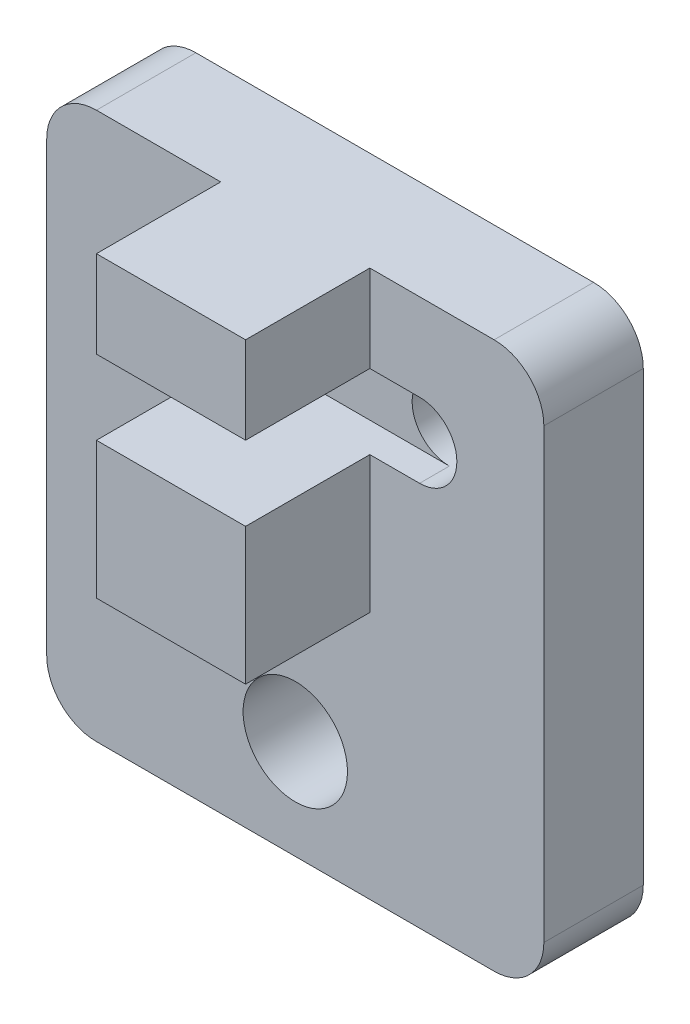
ISO-10303-21;
HEADER;
FILE_DESCRIPTION(('STEP AP214'),'2;1');
FILE_NAME('part.step','',(''),(''),'','','');
FILE_SCHEMA(('AUTOMOTIVE_DESIGN { 1 0 10303 214 1 1 1 1 }'));
ENDSEC;
DATA;
#1=APPLICATION_CONTEXT('core data for automotive mechanical design processes');
#2=APPLICATION_PROTOCOL_DEFINITION('international standard','automotive_design',2000,#1);
#3=PRODUCT_CONTEXT('',#1,'mechanical');
#4=PRODUCT('Part','Part','',(#3));
#5=PRODUCT_RELATED_PRODUCT_CATEGORY('part','',(#4));
#6=PRODUCT_DEFINITION_FORMATION('','',#4);
#7=PRODUCT_DEFINITION_CONTEXT('part definition',#1,'design');
#8=PRODUCT_DEFINITION('design','',#6,#7);
#9=PRODUCT_DEFINITION_SHAPE('','',#8);
#10=(LENGTH_UNIT() NAMED_UNIT(*) SI_UNIT(.MILLI.,.METRE.));
#11=(NAMED_UNIT(*) PLANE_ANGLE_UNIT() SI_UNIT($,.RADIAN.));
#12=(NAMED_UNIT(*) SI_UNIT($,.STERADIAN.) SOLID_ANGLE_UNIT());
#13=UNCERTAINTY_MEASURE_WITH_UNIT(LENGTH_MEASURE(1.E-05),#10,'distance_accuracy_value','');
#14=(GEOMETRIC_REPRESENTATION_CONTEXT(3) GLOBAL_UNCERTAINTY_ASSIGNED_CONTEXT((#13)) GLOBAL_UNIT_ASSIGNED_CONTEXT((#10,
#11,#12)) REPRESENTATION_CONTEXT('',''));
#15=CARTESIAN_POINT('',(0.,0.,0.));
#16=DIRECTION('',(0.,0.,1.));
#17=DIRECTION('',(1.,0.,0.));
#18=AXIS2_PLACEMENT_3D('',#15,#16,#17);
#19=CARTESIAN_POINT('',(15.,17.,4.));
#20=DIRECTION('',(0.,0.,-1.));
#21=DIRECTION('',(-1.,0.,0.));
#22=AXIS2_PLACEMENT_3D('',#19,#20,#21);
#23=CYLINDRICAL_SURFACE('',#22,1.5);
#24=CARTESIAN_POINT('',(15.,17.,0.));
#25=DIRECTION('',(0.,0.,1.));
#26=DIRECTION('',(1.,0.,0.));
#27=AXIS2_PLACEMENT_3D('',#24,#25,#26);
#28=CIRCLE('',#27,1.5);
#29=CARTESIAN_POINT('',(16.5,17.,0.));
#30=VERTEX_POINT('',#29);
#31=EDGE_CURVE('E249',#30,#30,#28,.F.);
#32=ORIENTED_EDGE('',*,*,#31,.T.);
#33=EDGE_LOOP('',(#32));
#34=FACE_BOUND('',#33,.T.);
#35=DIRECTION('',(0.,0.,-1.));
#36=VECTOR('',#35,1.);
#37=CARTESIAN_POINT('',(15.,18.5,4.));
#38=LINE('',#37,#36);
#39=CARTESIAN_POINT('',(15.,18.5,4.));
#40=VERTEX_POINT('',#39);
#41=CARTESIAN_POINT('',(15.,18.5,2.8));
#42=VERTEX_POINT('',#41);
#43=EDGE_CURVE('E182',#40,#42,#38,.T.);
#44=ORIENTED_EDGE('',*,*,#43,.T.);
#45=CARTESIAN_POINT('',(15.,17.,2.8));
#46=DIRECTION('',(0.,0.,-1.));
#47=DIRECTION('',(0.,1.,0.));
#48=AXIS2_PLACEMENT_3D('',#45,#46,#47);
#49=CIRCLE('',#48,1.5);
#50=CARTESIAN_POINT('',(15.,15.5,2.8));
#51=VERTEX_POINT('',#50);
#52=EDGE_CURVE('E11',#42,#51,#49,.F.);
#53=ORIENTED_EDGE('',*,*,#52,.T.);
#54=DIRECTION('',(0.,0.,1.));
#55=VECTOR('',#54,1.);
#56=CARTESIAN_POINT('',(15.,15.5,2.8));
#57=LINE('',#56,#55);
#58=CARTESIAN_POINT('',(15.,15.5,4.));
#59=VERTEX_POINT('',#58);
#60=EDGE_CURVE('E185',#51,#59,#57,.T.);
#61=ORIENTED_EDGE('',*,*,#60,.T.);
#62=CARTESIAN_POINT('',(15.,17.,4.));
#63=DIRECTION('',(0.,0.,1.));
#64=DIRECTION('',(1.,0.,0.));
#65=AXIS2_PLACEMENT_3D('',#62,#63,#64);
#66=CIRCLE('',#65,1.5);
#67=EDGE_CURVE('E195',#40,#59,#66,.F.);
#68=ORIENTED_EDGE('',*,*,#67,.F.);
#69=EDGE_LOOP('',(#44,#53,#61,#68));
#70=FACE_BOUND('',#69,.T.);
#71=ADVANCED_FACE('F35',(#34,#70),#23,.F.);
#72=CARTESIAN_POINT('',(13.,0.,9.));
#73=DIRECTION('',(1.,0.,0.));
#74=DIRECTION('',(0.,1.,0.));
#75=AXIS2_PLACEMENT_3D('',#72,#73,#74);
#76=PLANE('',#75);
#77=DIRECTION('',(0.,0.,1.));
#78=VECTOR('',#77,1.);
#79=CARTESIAN_POINT('',(13.,18.5,9.));
#80=LINE('',#79,#78);
#81=CARTESIAN_POINT('',(13.,18.5,4.));
#82=VERTEX_POINT('',#81);
#83=CARTESIAN_POINT('',(13.,18.5,9.));
#84=VERTEX_POINT('',#83);
#85=EDGE_CURVE('E212',#82,#84,#80,.T.);
#86=ORIENTED_EDGE('',*,*,#85,.F.);
#87=DIRECTION('',(0.,-1.,0.));
#88=VECTOR('',#87,1.);
#89=CARTESIAN_POINT('',(13.,0.,4.));
#90=LINE('',#89,#88);
#91=CARTESIAN_POINT('',(13.,22.,4.));
#92=VERTEX_POINT('',#91);
#93=EDGE_CURVE('E251',#92,#82,#90,.T.);
#94=ORIENTED_EDGE('',*,*,#93,.F.);
#95=DIRECTION('',(0.,0.,-1.));
#96=VECTOR('',#95,1.);
#97=CARTESIAN_POINT('',(13.,22.,9.));
#98=LINE('',#97,#96);
#99=CARTESIAN_POINT('',(13.,22.,9.));
#100=VERTEX_POINT('',#99);
#101=EDGE_CURVE('E241',#100,#92,#98,.T.);
#102=ORIENTED_EDGE('',*,*,#101,.F.);
#103=DIRECTION('',(0.,-1.,0.));
#104=VECTOR('',#103,1.);
#105=CARTESIAN_POINT('',(13.,0.,9.));
#106=LINE('',#105,#104);
#107=EDGE_CURVE('E219',#100,#84,#106,.T.);
#108=ORIENTED_EDGE('',*,*,#107,.T.);
#109=EDGE_LOOP('',(#86,#94,#102,#108));
#110=FACE_BOUND('',#109,.T.);
#111=ADVANCED_FACE('F372',(#110),#76,.T.);
#112=CARTESIAN_POINT('',(7.,0.,9.));
#113=DIRECTION('',(1.,0.,0.));
#114=DIRECTION('',(0.,1.,0.));
#115=AXIS2_PLACEMENT_3D('',#112,#113,#114);
#116=PLANE('',#115);
#117=DIRECTION('',(0.,-1.,0.));
#118=VECTOR('',#117,1.);
#119=CARTESIAN_POINT('',(7.,0.,4.));
#120=LINE('',#119,#118);
#121=CARTESIAN_POINT('',(7.,22.,4.));
#122=VERTEX_POINT('',#121);
#123=CARTESIAN_POINT('',(7.,18.5,4.));
#124=VERTEX_POINT('',#123);
#125=EDGE_CURVE('E258',#122,#124,#120,.T.);
#126=ORIENTED_EDGE('',*,*,#125,.T.);
#127=DIRECTION('',(0.,0.,1.));
#128=VECTOR('',#127,1.);
#129=CARTESIAN_POINT('',(7.,18.5,9.));
#130=LINE('',#129,#128);
#131=CARTESIAN_POINT('',(7.,18.5,9.));
#132=VERTEX_POINT('',#131);
#133=EDGE_CURVE('E209',#124,#132,#130,.T.);
#134=ORIENTED_EDGE('',*,*,#133,.T.);
#135=DIRECTION('',(0.,-1.,0.));
#136=VECTOR('',#135,1.);
#137=CARTESIAN_POINT('',(7.,0.,9.));
#138=LINE('',#137,#136);
#139=CARTESIAN_POINT('',(7.,22.,9.));
#140=VERTEX_POINT('',#139);
#141=EDGE_CURVE('E226',#140,#132,#138,.T.);
#142=ORIENTED_EDGE('',*,*,#141,.F.);
#143=DIRECTION('',(0.,0.,-1.));
#144=VECTOR('',#143,1.);
#145=CARTESIAN_POINT('',(7.,22.,9.));
#146=LINE('',#145,#144);
#147=EDGE_CURVE('E238',#140,#122,#146,.T.);
#148=ORIENTED_EDGE('',*,*,#147,.T.);
#149=EDGE_LOOP('',(#126,#134,#142,#148));
#150=FACE_BOUND('',#149,.T.);
#151=ADVANCED_FACE('F339',(#150),#116,.F.);
#152=CARTESIAN_POINT('',(0.,0.,9.));
#153=DIRECTION('',(0.,0.,1.));
#154=DIRECTION('',(1.,0.,0.));
#155=AXIS2_PLACEMENT_3D('',#152,#153,#154);
#156=PLANE('',#155);
#157=DIRECTION('',(-1.,0.,0.));
#158=VECTOR('',#157,1.);
#159=CARTESIAN_POINT('',(0.,18.5,9.));
#160=LINE('',#159,#158);
#161=EDGE_CURVE('E43',#84,#132,#160,.T.);
#162=ORIENTED_EDGE('',*,*,#161,.F.);
#163=ORIENTED_EDGE('',*,*,#107,.F.);
#164=DIRECTION('',(1.,0.,0.));
#165=VECTOR('',#164,1.);
#166=CARTESIAN_POINT('',(0.,22.,9.));
#167=LINE('',#166,#165);
#168=EDGE_CURVE('E222',#140,#100,#167,.T.);
#169=ORIENTED_EDGE('',*,*,#168,.F.);
#170=ORIENTED_EDGE('',*,*,#141,.T.);
#171=EDGE_LOOP('',(#162,#163,#169,#170));
#172=FACE_BOUND('',#171,.T.);
#173=ADVANCED_FACE('F342',(#172),#156,.T.);
#174=CARTESIAN_POINT('',(0.,22.,4.));
#175=DIRECTION('',(0.,1.,0.));
#176=DIRECTION('',(0.,0.,1.));
#177=AXIS2_PLACEMENT_3D('',#174,#175,#176);
#178=PLANE('',#177);
#179=DIRECTION('',(1.,0.,0.));
#180=VECTOR('',#179,1.);
#181=CARTESIAN_POINT('',(0.,22.,4.));
#182=LINE('',#181,#180);
#183=CARTESIAN_POINT('',(18.,22.,4.));
#184=VERTEX_POINT('',#183);
#185=EDGE_CURVE('E245',#92,#184,#182,.T.);
#186=ORIENTED_EDGE('',*,*,#185,.T.);
#187=DIRECTION('',(0.,0.,-1.));
#188=VECTOR('',#187,1.);
#189=CARTESIAN_POINT('',(18.,22.,0.));
#190=LINE('',#189,#188);
#191=CARTESIAN_POINT('',(18.,22.,0.));
#192=VERTEX_POINT('',#191);
#193=EDGE_CURVE('E327',#184,#192,#190,.T.);
#194=ORIENTED_EDGE('',*,*,#193,.T.);
#195=DIRECTION('',(1.,0.,0.));
#196=VECTOR('',#195,1.);
#197=CARTESIAN_POINT('',(0.,22.,0.));
#198=LINE('',#197,#196);
#199=CARTESIAN_POINT('',(2.,22.,0.));
#200=VERTEX_POINT('',#199);
#201=EDGE_CURVE('E244',#200,#192,#198,.T.);
#202=ORIENTED_EDGE('',*,*,#201,.F.);
#203=DIRECTION('',(0.,0.,-1.));
#204=VECTOR('',#203,1.);
#205=CARTESIAN_POINT('',(2.,22.,4.));
#206=LINE('',#205,#204);
#207=CARTESIAN_POINT('',(2.,22.,4.));
#208=VERTEX_POINT('',#207);
#209=EDGE_CURVE('E325',#200,#208,#206,.F.);
#210=ORIENTED_EDGE('',*,*,#209,.T.);
#211=EDGE_CURVE('E250',#208,#122,#182,.T.);
#212=ORIENTED_EDGE('',*,*,#211,.T.);
#213=ORIENTED_EDGE('',*,*,#147,.F.);
#214=ORIENTED_EDGE('',*,*,#168,.T.);
#215=ORIENTED_EDGE('',*,*,#101,.T.);
#216=EDGE_LOOP('',(#186,#194,#202,#210,#212,#213,#214,#215));
#217=FACE_BOUND('',#216,.T.);
#218=ADVANCED_FACE('F344',(#217),#178,.T.);
#219=CARTESIAN_POINT('',(0.,0.,4.));
#220=DIRECTION('',(-1.,0.,0.));
#221=DIRECTION('',(0.,-1.,0.));
#222=AXIS2_PLACEMENT_3D('',#219,#220,#221);
#223=PLANE('',#222);
#224=DIRECTION('',(0.,1.,0.));
#225=VECTOR('',#224,1.);
#226=CARTESIAN_POINT('',(0.,0.,0.));
#227=LINE('',#226,#225);
#228=CARTESIAN_POINT('',(0.,2.,0.));
#229=VERTEX_POINT('',#228);
#230=CARTESIAN_POINT('',(0.,20.,0.));
#231=VERTEX_POINT('',#230);
#232=EDGE_CURVE('E279',#229,#231,#227,.T.);
#233=ORIENTED_EDGE('',*,*,#232,.F.);
#234=DIRECTION('',(0.,0.,-1.));
#235=VECTOR('',#234,1.);
#236=CARTESIAN_POINT('',(0.,2.,4.));
#237=LINE('',#236,#235);
#238=CARTESIAN_POINT('',(0.,2.,4.));
#239=VERTEX_POINT('',#238);
#240=EDGE_CURVE('E323',#229,#239,#237,.F.);
#241=ORIENTED_EDGE('',*,*,#240,.T.);
#242=DIRECTION('',(0.,1.,0.));
#243=VECTOR('',#242,1.);
#244=CARTESIAN_POINT('',(0.,0.,4.));
#245=LINE('',#244,#243);
#246=CARTESIAN_POINT('',(0.,20.,4.));
#247=VERTEX_POINT('',#246);
#248=EDGE_CURVE('E261',#239,#247,#245,.T.);
#249=ORIENTED_EDGE('',*,*,#248,.T.);
#250=DIRECTION('',(0.,0.,-1.));
#251=VECTOR('',#250,1.);
#252=CARTESIAN_POINT('',(0.,20.,4.));
#253=LINE('',#252,#251);
#254=EDGE_CURVE('E320',#247,#231,#253,.T.);
#255=ORIENTED_EDGE('',*,*,#254,.T.);
#256=EDGE_LOOP('',(#233,#241,#249,#255));
#257=FACE_BOUND('',#256,.T.);
#258=ADVANCED_FACE('F410',(#257),#223,.T.);
#259=CARTESIAN_POINT('',(0.,0.,4.));
#260=DIRECTION('',(0.,1.,0.));
#261=DIRECTION('',(0.,0.,1.));
#262=AXIS2_PLACEMENT_3D('',#259,#260,#261);
#263=PLANE('',#262);
#264=DIRECTION('',(1.,0.,0.));
#265=VECTOR('',#264,1.);
#266=CARTESIAN_POINT('',(0.,0.,0.));
#267=LINE('',#266,#265);
#268=CARTESIAN_POINT('',(2.,0.,0.));
#269=VERTEX_POINT('',#268);
#270=CARTESIAN_POINT('',(18.,0.,0.));
#271=VERTEX_POINT('',#270);
#272=EDGE_CURVE('E282',#269,#271,#267,.T.);
#273=ORIENTED_EDGE('',*,*,#272,.T.);
#274=DIRECTION('',(0.,0.,-1.));
#275=VECTOR('',#274,1.);
#276=CARTESIAN_POINT('',(18.,0.,4.));
#277=LINE('',#276,#275);
#278=CARTESIAN_POINT('',(18.,0.,4.));
#279=VERTEX_POINT('',#278);
#280=EDGE_CURVE('E311',#271,#279,#277,.F.);
#281=ORIENTED_EDGE('',*,*,#280,.T.);
#282=DIRECTION('',(1.,0.,0.));
#283=VECTOR('',#282,1.);
#284=CARTESIAN_POINT('',(0.,0.,4.));
#285=LINE('',#284,#283);
#286=CARTESIAN_POINT('',(2.,0.,4.));
#287=VERTEX_POINT('',#286);
#288=EDGE_CURVE('E263',#287,#279,#285,.T.);
#289=ORIENTED_EDGE('',*,*,#288,.F.);
#290=DIRECTION('',(0.,0.,-1.));
#291=VECTOR('',#290,1.);
#292=CARTESIAN_POINT('',(2.,0.,0.));
#293=LINE('',#292,#291);
#294=EDGE_CURVE('E308',#287,#269,#293,.T.);
#295=ORIENTED_EDGE('',*,*,#294,.T.);
#296=EDGE_LOOP('',(#273,#281,#289,#295));
#297=FACE_BOUND('',#296,.T.);
#298=ADVANCED_FACE('F401',(#297),#263,.F.);
#299=CARTESIAN_POINT('',(5.,17.,4.));
#300=DIRECTION('',(0.,0.,-1.));
#301=DIRECTION('',(-1.,0.,0.));
#302=AXIS2_PLACEMENT_3D('',#299,#300,#301);
#303=CYLINDRICAL_SURFACE('',#302,1.5);
#304=DIRECTION('',(0.,0.,-1.));
#305=VECTOR('',#304,1.);
#306=CARTESIAN_POINT('',(5.,18.5,2.8));
#307=LINE('',#306,#305);
#308=CARTESIAN_POINT('',(5.,18.5,4.));
#309=VERTEX_POINT('',#308);
#310=CARTESIAN_POINT('',(5.,18.5,2.8));
#311=VERTEX_POINT('',#310);
#312=EDGE_CURVE('E192',#309,#311,#307,.T.);
#313=ORIENTED_EDGE('',*,*,#312,.F.);
#314=CARTESIAN_POINT('',(5.,17.,4.));
#315=DIRECTION('',(0.,0.,1.));
#316=DIRECTION('',(1.,0.,0.));
#317=AXIS2_PLACEMENT_3D('',#314,#315,#316);
#318=CIRCLE('',#317,1.5);
#319=CARTESIAN_POINT('',(5.,15.5,4.));
#320=VERTEX_POINT('',#319);
#321=EDGE_CURVE('E272',#309,#320,#318,.T.);
#322=ORIENTED_EDGE('',*,*,#321,.T.);
#323=DIRECTION('',(0.,0.,1.));
#324=VECTOR('',#323,1.);
#325=CARTESIAN_POINT('',(5.,15.5,14.));
#326=LINE('',#325,#324);
#327=CARTESIAN_POINT('',(5.,15.5,2.8));
#328=VERTEX_POINT('',#327);
#329=EDGE_CURVE('E200',#328,#320,#326,.T.);
#330=ORIENTED_EDGE('',*,*,#329,.F.);
#331=CARTESIAN_POINT('',(5.,17.,2.8));
#332=DIRECTION('',(0.,0.,-1.));
#333=DIRECTION('',(0.,1.,0.));
#334=AXIS2_PLACEMENT_3D('',#331,#332,#333);
#335=CIRCLE('',#334,1.5);
#336=EDGE_CURVE('E179',#311,#328,#335,.T.);
#337=ORIENTED_EDGE('',*,*,#336,.F.);
#338=EDGE_LOOP('',(#313,#322,#330,#337));
#339=FACE_BOUND('',#338,.T.);
#340=CARTESIAN_POINT('',(5.,17.,0.));
#341=DIRECTION('',(0.,0.,1.));
#342=DIRECTION('',(1.,0.,0.));
#343=AXIS2_PLACEMENT_3D('',#340,#341,#342);
#344=CIRCLE('',#343,1.5);
#345=CARTESIAN_POINT('',(6.5,17.,0.));
#346=VERTEX_POINT('',#345);
#347=EDGE_CURVE('E291',#346,#346,#344,.T.);
#348=ORIENTED_EDGE('',*,*,#347,.F.);
#349=EDGE_LOOP('',(#348));
#350=FACE_BOUND('',#349,.T.);
#351=ADVANCED_FACE('F352',(#339,#350),#303,.F.);
#352=CARTESIAN_POINT('',(10.,4.,4.));
#353=DIRECTION('',(0.,0.,-1.));
#354=DIRECTION('',(-1.,0.,0.));
#355=AXIS2_PLACEMENT_3D('',#352,#353,#354);
#356=CYLINDRICAL_SURFACE('',#355,2.1);
#357=CARTESIAN_POINT('',(10.,4.,4.));
#358=DIRECTION('',(0.,0.,1.));
#359=DIRECTION('',(1.,0.,0.));
#360=AXIS2_PLACEMENT_3D('',#357,#358,#359);
#361=CIRCLE('',#360,2.1);
#362=CARTESIAN_POINT('',(12.1,4.,4.));
#363=VERTEX_POINT('',#362);
#364=EDGE_CURVE('E269',#363,#363,#361,.T.);
#365=ORIENTED_EDGE('',*,*,#364,.T.);
#366=EDGE_LOOP('',(#365));
#367=FACE_BOUND('',#366,.T.);
#368=CARTESIAN_POINT('',(10.,4.,0.));
#369=DIRECTION('',(0.,0.,1.));
#370=DIRECTION('',(1.,0.,0.));
#371=AXIS2_PLACEMENT_3D('',#368,#369,#370);
#372=CIRCLE('',#371,2.1);
#373=CARTESIAN_POINT('',(12.1,4.,0.));
#374=VERTEX_POINT('',#373);
#375=EDGE_CURVE('E288',#374,#374,#372,.T.);
#376=ORIENTED_EDGE('',*,*,#375,.F.);
#377=EDGE_LOOP('',(#376));
#378=FACE_BOUND('',#377,.T.);
#379=ADVANCED_FACE('F400',(#367,#378),#356,.F.);
#380=CARTESIAN_POINT('',(20.,0.,4.));
#381=DIRECTION('',(-1.,0.,0.));
#382=DIRECTION('',(0.,-1.,0.));
#383=AXIS2_PLACEMENT_3D('',#380,#381,#382);
#384=PLANE('',#383);
#385=DIRECTION('',(0.,1.,0.));
#386=VECTOR('',#385,1.);
#387=CARTESIAN_POINT('',(20.,0.,4.));
#388=LINE('',#387,#386);
#389=CARTESIAN_POINT('',(20.,2.,4.));
#390=VERTEX_POINT('',#389);
#391=CARTESIAN_POINT('',(20.,20.,4.));
#392=VERTEX_POINT('',#391);
#393=EDGE_CURVE('E266',#390,#392,#388,.T.);
#394=ORIENTED_EDGE('',*,*,#393,.F.);
#395=DIRECTION('',(0.,0.,-1.));
#396=VECTOR('',#395,1.);
#397=CARTESIAN_POINT('',(20.,2.,4.));
#398=LINE('',#397,#396);
#399=CARTESIAN_POINT('',(20.,2.,0.));
#400=VERTEX_POINT('',#399);
#401=EDGE_CURVE('E297',#390,#400,#398,.T.);
#402=ORIENTED_EDGE('',*,*,#401,.T.);
#403=DIRECTION('',(0.,1.,0.));
#404=VECTOR('',#403,1.);
#405=CARTESIAN_POINT('',(20.,0.,0.));
#406=LINE('',#405,#404);
#407=CARTESIAN_POINT('',(20.,20.,0.));
#408=VERTEX_POINT('',#407);
#409=EDGE_CURVE('E285',#400,#408,#406,.T.);
#410=ORIENTED_EDGE('',*,*,#409,.T.);
#411=DIRECTION('',(0.,0.,-1.));
#412=VECTOR('',#411,1.);
#413=CARTESIAN_POINT('',(20.,20.,4.));
#414=LINE('',#413,#412);
#415=EDGE_CURVE('E276',#408,#392,#414,.F.);
#416=ORIENTED_EDGE('',*,*,#415,.T.);
#417=EDGE_LOOP('',(#394,#402,#410,#416));
#418=FACE_BOUND('',#417,.T.);
#419=ADVANCED_FACE('F394',(#418),#384,.F.);
#420=CARTESIAN_POINT('',(0.,0.,4.));
#421=DIRECTION('',(0.,0.,1.));
#422=DIRECTION('',(1.,0.,0.));
#423=AXIS2_PLACEMENT_3D('',#420,#421,#422);
#424=PLANE('',#423);
#425=DIRECTION('',(-1.,0.,0.));
#426=VECTOR('',#425,1.);
#427=CARTESIAN_POINT('',(0.,18.5,4.));
#428=LINE('',#427,#426);
#429=EDGE_CURVE('E216',#40,#82,#428,.T.);
#430=ORIENTED_EDGE('',*,*,#429,.F.);
#431=ORIENTED_EDGE('',*,*,#67,.T.);
#432=DIRECTION('',(1.,0.,0.));
#433=VECTOR('',#432,1.);
#434=CARTESIAN_POINT('',(0.,15.5,4.));
#435=LINE('',#434,#433);
#436=CARTESIAN_POINT('',(13.,15.5,4.));
#437=VERTEX_POINT('',#436);
#438=EDGE_CURVE('E188',#437,#59,#435,.T.);
#439=ORIENTED_EDGE('',*,*,#438,.F.);
#440=CARTESIAN_POINT('',(13.,10.,4.));
#441=VERTEX_POINT('',#440);
#442=EDGE_CURVE('E248',#437,#441,#90,.T.);
#443=ORIENTED_EDGE('',*,*,#442,.T.);
#444=DIRECTION('',(1.,0.,0.));
#445=VECTOR('',#444,1.);
#446=CARTESIAN_POINT('',(0.,10.,4.));
#447=LINE('',#446,#445);
#448=CARTESIAN_POINT('',(7.,10.,4.));
#449=VERTEX_POINT('',#448);
#450=EDGE_CURVE('E254',#449,#441,#447,.T.);
#451=ORIENTED_EDGE('',*,*,#450,.F.);
#452=CARTESIAN_POINT('',(7.,15.5,4.));
#453=VERTEX_POINT('',#452);
#454=EDGE_CURVE('E257',#453,#449,#120,.T.);
#455=ORIENTED_EDGE('',*,*,#454,.F.);
#456=EDGE_CURVE('E208',#320,#453,#435,.T.);
#457=ORIENTED_EDGE('',*,*,#456,.F.);
#458=ORIENTED_EDGE('',*,*,#321,.F.);
#459=EDGE_CURVE('E214',#124,#309,#428,.T.);
#460=ORIENTED_EDGE('',*,*,#459,.F.);
#461=ORIENTED_EDGE('',*,*,#125,.F.);
#462=ORIENTED_EDGE('',*,*,#211,.F.);
#463=CARTESIAN_POINT('',(2.,20.,4.));
#464=DIRECTION('',(0.,0.,1.));
#465=DIRECTION('',(1.,0.,0.));
#466=AXIS2_PLACEMENT_3D('',#463,#464,#465);
#467=CIRCLE('',#466,2.);
#468=EDGE_CURVE('E58',#208,#247,#467,.T.);
#469=ORIENTED_EDGE('',*,*,#468,.T.);
#470=ORIENTED_EDGE('',*,*,#248,.F.);
#471=CARTESIAN_POINT('',(2.,2.,4.));
#472=DIRECTION('',(0.,0.,1.));
#473=DIRECTION('',(1.,0.,0.));
#474=AXIS2_PLACEMENT_3D('',#471,#472,#473);
#475=CIRCLE('',#474,2.);
#476=EDGE_CURVE('E316',#239,#287,#475,.T.);
#477=ORIENTED_EDGE('',*,*,#476,.T.);
#478=ORIENTED_EDGE('',*,*,#288,.T.);
#479=CARTESIAN_POINT('',(18.,2.,4.));
#480=DIRECTION('',(0.,0.,1.));
#481=DIRECTION('',(1.,0.,0.));
#482=AXIS2_PLACEMENT_3D('',#479,#480,#481);
#483=CIRCLE('',#482,2.);
#484=EDGE_CURVE('E318',#279,#390,#483,.T.);
#485=ORIENTED_EDGE('',*,*,#484,.T.);
#486=ORIENTED_EDGE('',*,*,#393,.T.);
#487=CARTESIAN_POINT('',(18.,20.,4.));
#488=DIRECTION('',(0.,0.,1.));
#489=DIRECTION('',(1.,0.,0.));
#490=AXIS2_PLACEMENT_3D('',#487,#488,#489);
#491=CIRCLE('',#490,2.);
#492=EDGE_CURVE('E314',#392,#184,#491,.T.);
#493=ORIENTED_EDGE('',*,*,#492,.T.);
#494=ORIENTED_EDGE('',*,*,#185,.F.);
#495=ORIENTED_EDGE('',*,*,#93,.T.);
#496=EDGE_LOOP('',(#430,#431,#439,#443,#451,#455,#457,#458,#460,#461,#462,#469,#470,#477,#478,
#485,#486,#493,#494,#495));
#497=FACE_BOUND('',#496,.T.);
#498=ORIENTED_EDGE('',*,*,#364,.F.);
#499=EDGE_LOOP('',(#498));
#500=FACE_BOUND('',#499,.T.);
#501=ADVANCED_FACE('F346',(#497,#500),#424,.T.);
#502=CARTESIAN_POINT('',(0.,0.,0.));
#503=DIRECTION('',(0.,0.,1.));
#504=DIRECTION('',(1.,0.,0.));
#505=AXIS2_PLACEMENT_3D('',#502,#503,#504);
#506=PLANE('',#505);
#507=ORIENTED_EDGE('',*,*,#409,.F.);
#508=CARTESIAN_POINT('',(18.,2.,0.));
#509=DIRECTION('',(0.,0.,1.));
#510=DIRECTION('',(1.,0.,0.));
#511=AXIS2_PLACEMENT_3D('',#508,#509,#510);
#512=CIRCLE('',#511,2.);
#513=EDGE_CURVE('E306',#400,#271,#512,.F.);
#514=ORIENTED_EDGE('',*,*,#513,.T.);
#515=ORIENTED_EDGE('',*,*,#272,.F.);
#516=CARTESIAN_POINT('',(2.,2.,0.));
#517=DIRECTION('',(0.,0.,1.));
#518=DIRECTION('',(1.,0.,0.));
#519=AXIS2_PLACEMENT_3D('',#516,#517,#518);
#520=CIRCLE('',#519,2.);
#521=EDGE_CURVE('E304',#269,#229,#520,.F.);
#522=ORIENTED_EDGE('',*,*,#521,.T.);
#523=ORIENTED_EDGE('',*,*,#232,.T.);
#524=CARTESIAN_POINT('',(2.,20.,0.));
#525=DIRECTION('',(0.,0.,1.));
#526=DIRECTION('',(1.,0.,0.));
#527=AXIS2_PLACEMENT_3D('',#524,#525,#526);
#528=CIRCLE('',#527,2.);
#529=EDGE_CURVE('E300',#231,#200,#528,.F.);
#530=ORIENTED_EDGE('',*,*,#529,.T.);
#531=ORIENTED_EDGE('',*,*,#201,.T.);
#532=CARTESIAN_POINT('',(18.,20.,0.));
#533=DIRECTION('',(0.,0.,1.));
#534=DIRECTION('',(1.,0.,0.));
#535=AXIS2_PLACEMENT_3D('',#532,#533,#534);
#536=CIRCLE('',#535,2.);
#537=EDGE_CURVE('E302',#192,#408,#536,.F.);
#538=ORIENTED_EDGE('',*,*,#537,.T.);
#539=EDGE_LOOP('',(#507,#514,#515,#522,#523,#530,#531,#538));
#540=FACE_BOUND('',#539,.T.);
#541=ORIENTED_EDGE('',*,*,#375,.T.);
#542=EDGE_LOOP('',(#541));
#543=FACE_BOUND('',#542,.T.);
#544=ORIENTED_EDGE('',*,*,#347,.T.);
#545=EDGE_LOOP('',(#544));
#546=FACE_BOUND('',#545,.T.);
#547=ORIENTED_EDGE('',*,*,#31,.F.);
#548=EDGE_LOOP('',(#547));
#549=FACE_BOUND('',#548,.T.);
#550=ADVANCED_FACE('F384',(#540,#543,#546,#549),#506,.F.);
#551=DIRECTION('',(0.,0.,-1.));
#552=VECTOR('',#551,1.);
#553=CARTESIAN_POINT('',(13.,15.5,9.));
#554=LINE('',#553,#552);
#555=CARTESIAN_POINT('',(13.,15.5,9.));
#556=VERTEX_POINT('',#555);
#557=EDGE_CURVE('E205',#556,#437,#554,.T.);
#558=ORIENTED_EDGE('',*,*,#557,.F.);
#559=CARTESIAN_POINT('',(13.,10.,9.));
#560=VERTEX_POINT('',#559);
#561=EDGE_CURVE('E218',#556,#560,#106,.T.);
#562=ORIENTED_EDGE('',*,*,#561,.T.);
#563=DIRECTION('',(0.,0.,-1.));
#564=VECTOR('',#563,1.);
#565=CARTESIAN_POINT('',(13.,10.,9.));
#566=LINE('',#565,#564);
#567=EDGE_CURVE('E232',#560,#441,#566,.T.);
#568=ORIENTED_EDGE('',*,*,#567,.T.);
#569=ORIENTED_EDGE('',*,*,#442,.F.);
#570=EDGE_LOOP('',(#558,#562,#568,#569));
#571=FACE_BOUND('',#570,.T.);
#572=ADVANCED_FACE('F370',(#571),#76,.T.);
#573=CARTESIAN_POINT('',(7.,15.5,9.));
#574=VERTEX_POINT('',#573);
#575=CARTESIAN_POINT('',(7.,10.,9.));
#576=VERTEX_POINT('',#575);
#577=EDGE_CURVE('E225',#574,#576,#138,.T.);
#578=ORIENTED_EDGE('',*,*,#577,.F.);
#579=DIRECTION('',(0.,0.,-1.));
#580=VECTOR('',#579,1.);
#581=CARTESIAN_POINT('',(7.,15.5,9.));
#582=LINE('',#581,#580);
#583=EDGE_CURVE('E50',#574,#453,#582,.T.);
#584=ORIENTED_EDGE('',*,*,#583,.T.);
#585=ORIENTED_EDGE('',*,*,#454,.T.);
#586=DIRECTION('',(0.,0.,-1.));
#587=VECTOR('',#586,1.);
#588=CARTESIAN_POINT('',(7.,10.,9.));
#589=LINE('',#588,#587);
#590=EDGE_CURVE('E235',#576,#449,#589,.T.);
#591=ORIENTED_EDGE('',*,*,#590,.F.);
#592=EDGE_LOOP('',(#578,#584,#585,#591));
#593=FACE_BOUND('',#592,.T.);
#594=ADVANCED_FACE('F359',(#593),#116,.F.);
#595=CARTESIAN_POINT('',(0.,10.,9.));
#596=DIRECTION('',(0.,1.,0.));
#597=DIRECTION('',(0.,0.,1.));
#598=AXIS2_PLACEMENT_3D('',#595,#596,#597);
#599=PLANE('',#598);
#600=ORIENTED_EDGE('',*,*,#450,.T.);
#601=ORIENTED_EDGE('',*,*,#567,.F.);
#602=DIRECTION('',(1.,0.,0.));
#603=VECTOR('',#602,1.);
#604=CARTESIAN_POINT('',(0.,10.,9.));
#605=LINE('',#604,#603);
#606=EDGE_CURVE('E229',#576,#560,#605,.T.);
#607=ORIENTED_EDGE('',*,*,#606,.F.);
#608=ORIENTED_EDGE('',*,*,#590,.T.);
#609=EDGE_LOOP('',(#600,#601,#607,#608));
#610=FACE_BOUND('',#609,.T.);
#611=ADVANCED_FACE('F362',(#610),#599,.F.);
#612=DIRECTION('',(1.,0.,0.));
#613=VECTOR('',#612,1.);
#614=CARTESIAN_POINT('',(0.,15.5,9.));
#615=LINE('',#614,#613);
#616=EDGE_CURVE('E330',#574,#556,#615,.T.);
#617=ORIENTED_EDGE('',*,*,#616,.F.);
#618=ORIENTED_EDGE('',*,*,#577,.T.);
#619=ORIENTED_EDGE('',*,*,#606,.T.);
#620=ORIENTED_EDGE('',*,*,#561,.F.);
#621=EDGE_LOOP('',(#617,#618,#619,#620));
#622=FACE_BOUND('',#621,.T.);
#623=ADVANCED_FACE('F366',(#622),#156,.T.);
#624=CARTESIAN_POINT('',(18.,2.,4.));
#625=DIRECTION('',(0.,0.,-1.));
#626=DIRECTION('',(-1.,0.,0.));
#627=AXIS2_PLACEMENT_3D('',#624,#625,#626);
#628=CYLINDRICAL_SURFACE('',#627,2.);
#629=ORIENTED_EDGE('',*,*,#484,.F.);
#630=ORIENTED_EDGE('',*,*,#280,.F.);
#631=ORIENTED_EDGE('',*,*,#513,.F.);
#632=ORIENTED_EDGE('',*,*,#401,.F.);
#633=EDGE_LOOP('',(#629,#630,#631,#632));
#634=FACE_BOUND('',#633,.T.);
#635=ADVANCED_FACE('F417',(#634),#628,.T.);
#636=CARTESIAN_POINT('',(2.,2.,4.));
#637=DIRECTION('',(0.,0.,1.));
#638=DIRECTION('',(1.,0.,0.));
#639=AXIS2_PLACEMENT_3D('',#636,#637,#638);
#640=CYLINDRICAL_SURFACE('',#639,2.);
#641=ORIENTED_EDGE('',*,*,#476,.F.);
#642=ORIENTED_EDGE('',*,*,#240,.F.);
#643=ORIENTED_EDGE('',*,*,#521,.F.);
#644=ORIENTED_EDGE('',*,*,#294,.F.);
#645=EDGE_LOOP('',(#641,#642,#643,#644));
#646=FACE_BOUND('',#645,.T.);
#647=ADVANCED_FACE('F420',(#646),#640,.T.);
#648=CARTESIAN_POINT('',(18.,20.,4.));
#649=DIRECTION('',(0.,0.,1.));
#650=DIRECTION('',(1.,0.,0.));
#651=AXIS2_PLACEMENT_3D('',#648,#649,#650);
#652=CYLINDRICAL_SURFACE('',#651,2.);
#653=ORIENTED_EDGE('',*,*,#492,.F.);
#654=ORIENTED_EDGE('',*,*,#415,.F.);
#655=ORIENTED_EDGE('',*,*,#537,.F.);
#656=ORIENTED_EDGE('',*,*,#193,.F.);
#657=EDGE_LOOP('',(#653,#654,#655,#656));
#658=FACE_BOUND('',#657,.T.);
#659=ADVANCED_FACE('F423',(#658),#652,.T.);
#660=CARTESIAN_POINT('',(2.,20.,4.));
#661=DIRECTION('',(0.,0.,-1.));
#662=DIRECTION('',(-1.,0.,0.));
#663=AXIS2_PLACEMENT_3D('',#660,#661,#662);
#664=CYLINDRICAL_SURFACE('',#663,2.);
#665=ORIENTED_EDGE('',*,*,#468,.F.);
#666=ORIENTED_EDGE('',*,*,#209,.F.);
#667=ORIENTED_EDGE('',*,*,#529,.F.);
#668=ORIENTED_EDGE('',*,*,#254,.F.);
#669=EDGE_LOOP('',(#665,#666,#667,#668));
#670=FACE_BOUND('',#669,.T.);
#671=ADVANCED_FACE('F37',(#670),#664,.T.);
#672=CARTESIAN_POINT('',(15.,18.5,2.8));
#673=DIRECTION('',(0.,0.,-1.));
#674=DIRECTION('',(0.,1.,0.));
#675=AXIS2_PLACEMENT_3D('',#672,#673,#674);
#676=PLANE('',#675);
#677=ORIENTED_EDGE('',*,*,#336,.T.);
#678=DIRECTION('',(-1.,0.,0.));
#679=VECTOR('',#678,1.);
#680=CARTESIAN_POINT('',(15.,15.5,2.8));
#681=LINE('',#680,#679);
#682=EDGE_CURVE('E173',#51,#328,#681,.T.);
#683=ORIENTED_EDGE('',*,*,#682,.F.);
#684=ORIENTED_EDGE('',*,*,#52,.F.);
#685=DIRECTION('',(-1.,0.,0.));
#686=VECTOR('',#685,1.);
#687=CARTESIAN_POINT('',(15.,18.5,2.8));
#688=LINE('',#687,#686);
#689=EDGE_CURVE('E181',#42,#311,#688,.T.);
#690=ORIENTED_EDGE('',*,*,#689,.T.);
#691=EDGE_LOOP('',(#677,#683,#684,#690));
#692=FACE_BOUND('',#691,.T.);
#693=ADVANCED_FACE('F175',(#692),#676,.F.);
#694=CARTESIAN_POINT('',(15.,18.5,2.8));
#695=DIRECTION('',(0.,1.,0.));
#696=DIRECTION('',(-1.,0.,0.));
#697=AXIS2_PLACEMENT_3D('',#694,#695,#696);
#698=PLANE('',#697);
#699=ORIENTED_EDGE('',*,*,#429,.T.);
#700=ORIENTED_EDGE('',*,*,#85,.T.);
#701=ORIENTED_EDGE('',*,*,#161,.T.);
#702=ORIENTED_EDGE('',*,*,#133,.F.);
#703=ORIENTED_EDGE('',*,*,#459,.T.);
#704=ORIENTED_EDGE('',*,*,#312,.T.);
#705=ORIENTED_EDGE('',*,*,#689,.F.);
#706=ORIENTED_EDGE('',*,*,#43,.F.);
#707=EDGE_LOOP('',(#699,#700,#701,#702,#703,#704,#705,#706));
#708=FACE_BOUND('',#707,.T.);
#709=ADVANCED_FACE('F332',(#708),#698,.F.);
#710=CARTESIAN_POINT('',(15.,15.5,14.));
#711=DIRECTION('',(0.,-1.,0.));
#712=DIRECTION('',(0.,0.,-1.));
#713=AXIS2_PLACEMENT_3D('',#710,#711,#712);
#714=PLANE('',#713);
#715=ORIENTED_EDGE('',*,*,#456,.T.);
#716=ORIENTED_EDGE('',*,*,#583,.F.);
#717=ORIENTED_EDGE('',*,*,#616,.T.);
#718=ORIENTED_EDGE('',*,*,#557,.T.);
#719=ORIENTED_EDGE('',*,*,#438,.T.);
#720=ORIENTED_EDGE('',*,*,#60,.F.);
#721=ORIENTED_EDGE('',*,*,#682,.T.);
#722=ORIENTED_EDGE('',*,*,#329,.T.);
#723=EDGE_LOOP('',(#715,#716,#717,#718,#719,#720,#721,#722));
#724=FACE_BOUND('',#723,.T.);
#725=ADVANCED_FACE('F186',(#724),#714,.F.);
#726=CLOSED_SHELL('',(#71,#111,#151,#173,#218,#258,#298,#351,#379,#419,#501,#550,#572,#594,#611,
#623,#635,#647,#659,#671,#693,#709,#725));
#727=MANIFOLD_SOLID_BREP('B2',#726);
#728=ADVANCED_BREP_SHAPE_REPRESENTATION('',(#18,#727),#14);
#729=SHAPE_DEFINITION_REPRESENTATION(#9,#728);
ENDSEC;
END-ISO-10303-21;
